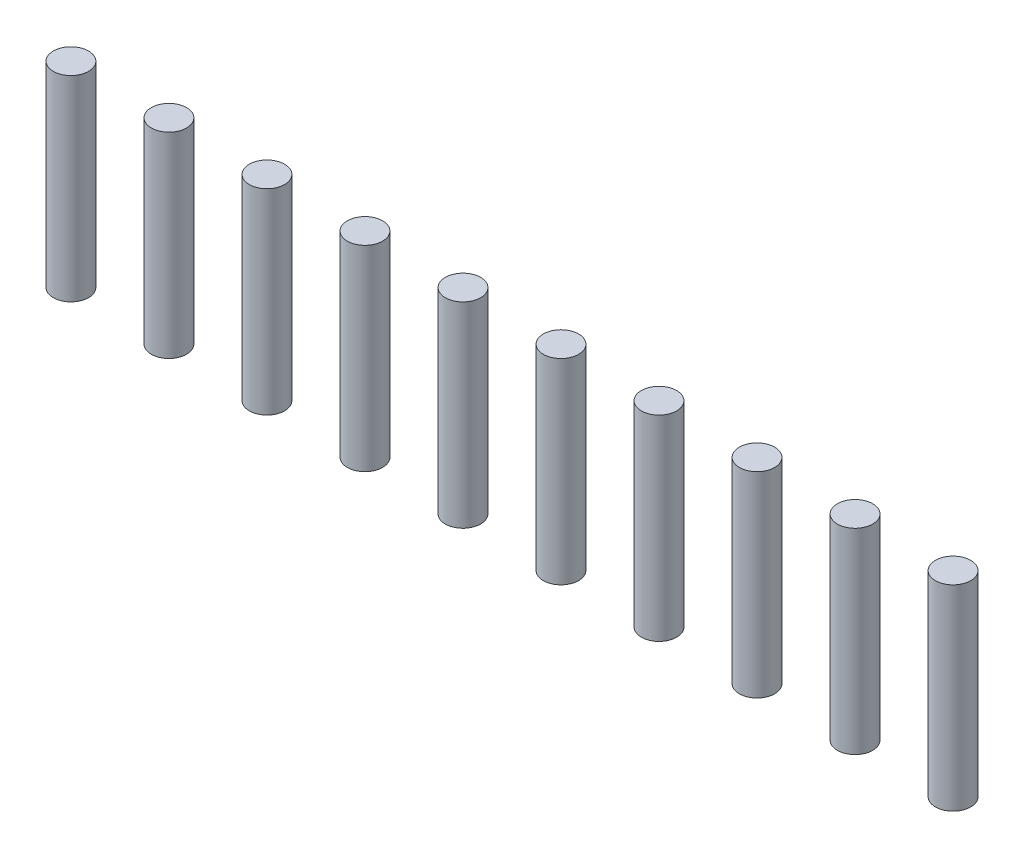
ISO-10303-21;
HEADER;
FILE_DESCRIPTION(('STEP AP214'),'2;1');
FILE_NAME('part.step','',(''),(''),'','','');
FILE_SCHEMA(('AUTOMOTIVE_DESIGN { 1 0 10303 214 1 1 1 1 }'));
ENDSEC;
DATA;
#1=APPLICATION_CONTEXT('core data for automotive mechanical design processes');
#2=APPLICATION_PROTOCOL_DEFINITION('international standard','automotive_design',2000,#1);
#3=PRODUCT_CONTEXT('',#1,'mechanical');
#4=PRODUCT('Part','Part','',(#3));
#5=PRODUCT_RELATED_PRODUCT_CATEGORY('part','',(#4));
#6=PRODUCT_DEFINITION_FORMATION('','',#4);
#7=PRODUCT_DEFINITION_CONTEXT('part definition',#1,'design');
#8=PRODUCT_DEFINITION('design','',#6,#7);
#9=PRODUCT_DEFINITION_SHAPE('','',#8);
#10=(LENGTH_UNIT() NAMED_UNIT(*) SI_UNIT(.MILLI.,.METRE.));
#11=(NAMED_UNIT(*) PLANE_ANGLE_UNIT() SI_UNIT($,.RADIAN.));
#12=(NAMED_UNIT(*) SI_UNIT($,.STERADIAN.) SOLID_ANGLE_UNIT());
#13=UNCERTAINTY_MEASURE_WITH_UNIT(LENGTH_MEASURE(1.E-05),#10,'distance_accuracy_value','');
#14=(GEOMETRIC_REPRESENTATION_CONTEXT(3) GLOBAL_UNCERTAINTY_ASSIGNED_CONTEXT((#13)) GLOBAL_UNIT_ASSIGNED_CONTEXT((#10,
#11,#12)) REPRESENTATION_CONTEXT('',''));
#15=CARTESIAN_POINT('',(0.,0.,0.));
#16=DIRECTION('',(0.,0.,1.));
#17=DIRECTION('',(1.,0.,0.));
#18=AXIS2_PLACEMENT_3D('',#15,#16,#17);
#19=CARTESIAN_POINT('',(90.,20.,0.));
#20=DIRECTION('',(0.,-1.,0.));
#21=DIRECTION('',(0.,0.,-1.));
#22=AXIS2_PLACEMENT_3D('',#19,#20,#21);
#23=CYLINDRICAL_SURFACE('',#22,1.79999999999999);
#24=CARTESIAN_POINT('',(90.,20.,0.));
#25=DIRECTION('',(0.,1.,0.));
#26=DIRECTION('',(0.,0.,1.));
#27=AXIS2_PLACEMENT_3D('',#24,#25,#26);
#28=CIRCLE('',#27,1.79999999999999);
#29=CARTESIAN_POINT('',(90.,20.,1.79999999999999));
#30=VERTEX_POINT('',#29);
#31=EDGE_CURVE('E11',#30,#30,#28,.T.);
#32=ORIENTED_EDGE('',*,*,#31,.F.);
#33=EDGE_LOOP('',(#32));
#34=FACE_BOUND('',#33,.T.);
#35=CARTESIAN_POINT('',(90.,0.,0.));
#36=DIRECTION('',(0.,1.,0.));
#37=DIRECTION('',(0.,0.,1.));
#38=AXIS2_PLACEMENT_3D('',#35,#36,#37);
#39=CIRCLE('',#38,1.79999999999999);
#40=CARTESIAN_POINT('',(90.,0.,1.79999999999999));
#41=VERTEX_POINT('',#40);
#42=EDGE_CURVE('E49',#41,#41,#39,.T.);
#43=ORIENTED_EDGE('',*,*,#42,.T.);
#44=EDGE_LOOP('',(#43));
#45=FACE_BOUND('',#44,.T.);
#46=ADVANCED_FACE('F46',(#34,#45),#23,.T.);
#47=CARTESIAN_POINT('',(90.,20.,0.));
#48=DIRECTION('',(0.,1.,0.));
#49=DIRECTION('',(0.,0.,1.));
#50=AXIS2_PLACEMENT_3D('',#47,#48,#49);
#51=PLANE('',#50);
#52=ORIENTED_EDGE('',*,*,#31,.T.);
#53=EDGE_LOOP('',(#52));
#54=FACE_BOUND('',#53,.T.);
#55=ADVANCED_FACE('F61',(#54),#51,.T.);
#56=CARTESIAN_POINT('',(90.,0.,0.));
#57=DIRECTION('',(0.,1.,0.));
#58=DIRECTION('',(0.,0.,1.));
#59=AXIS2_PLACEMENT_3D('',#56,#57,#58);
#60=PLANE('',#59);
#61=ORIENTED_EDGE('',*,*,#42,.F.);
#62=EDGE_LOOP('',(#61));
#63=FACE_BOUND('',#62,.T.);
#64=ADVANCED_FACE('F59',(#63),#60,.F.);
#65=CLOSED_SHELL('',(#46,#55,#64));
#66=MANIFOLD_SOLID_BREP('B2',#65);
#67=CARTESIAN_POINT('',(80.,20.,0.));
#68=DIRECTION('',(0.,-1.,0.));
#69=DIRECTION('',(0.,0.,-1.));
#70=AXIS2_PLACEMENT_3D('',#67,#68,#69);
#71=CYLINDRICAL_SURFACE('',#70,1.79999999999999);
#72=CARTESIAN_POINT('',(80.,20.,0.));
#73=DIRECTION('',(0.,1.,0.));
#74=DIRECTION('',(0.,0.,1.));
#75=AXIS2_PLACEMENT_3D('',#72,#73,#74);
#76=CIRCLE('',#75,1.79999999999999);
#77=CARTESIAN_POINT('',(80.,20.,1.79999999999999));
#78=VERTEX_POINT('',#77);
#79=EDGE_CURVE('E45',#78,#78,#76,.T.);
#80=ORIENTED_EDGE('',*,*,#79,.F.);
#81=EDGE_LOOP('',(#80));
#82=FACE_BOUND('',#81,.T.);
#83=CARTESIAN_POINT('',(80.,0.,0.));
#84=DIRECTION('',(0.,1.,0.));
#85=DIRECTION('',(0.,0.,1.));
#86=AXIS2_PLACEMENT_3D('',#83,#84,#85);
#87=CIRCLE('',#86,1.79999999999999);
#88=CARTESIAN_POINT('',(80.,0.,1.79999999999999));
#89=VERTEX_POINT('',#88);
#90=EDGE_CURVE('E98',#89,#89,#87,.T.);
#91=ORIENTED_EDGE('',*,*,#90,.T.);
#92=EDGE_LOOP('',(#91));
#93=FACE_BOUND('',#92,.T.);
#94=ADVANCED_FACE('F95',(#82,#93),#71,.T.);
#95=CARTESIAN_POINT('',(80.,20.,0.));
#96=DIRECTION('',(0.,1.,0.));
#97=DIRECTION('',(0.,0.,1.));
#98=AXIS2_PLACEMENT_3D('',#95,#96,#97);
#99=PLANE('',#98);
#100=ORIENTED_EDGE('',*,*,#79,.T.);
#101=EDGE_LOOP('',(#100));
#102=FACE_BOUND('',#101,.T.);
#103=ADVANCED_FACE('F110',(#102),#99,.T.);
#104=CARTESIAN_POINT('',(80.,0.,0.));
#105=DIRECTION('',(0.,1.,0.));
#106=DIRECTION('',(0.,0.,1.));
#107=AXIS2_PLACEMENT_3D('',#104,#105,#106);
#108=PLANE('',#107);
#109=ORIENTED_EDGE('',*,*,#90,.F.);
#110=EDGE_LOOP('',(#109));
#111=FACE_BOUND('',#110,.T.);
#112=ADVANCED_FACE('F108',(#111),#108,.F.);
#113=CLOSED_SHELL('',(#94,#103,#112));
#114=MANIFOLD_SOLID_BREP('B6',#113);
#115=CARTESIAN_POINT('',(70.,20.,0.));
#116=DIRECTION('',(0.,-1.,0.));
#117=DIRECTION('',(0.,0.,-1.));
#118=AXIS2_PLACEMENT_3D('',#115,#116,#117);
#119=CYLINDRICAL_SURFACE('',#118,1.79999999999999);
#120=CARTESIAN_POINT('',(70.,20.,0.));
#121=DIRECTION('',(0.,1.,0.));
#122=DIRECTION('',(0.,0.,1.));
#123=AXIS2_PLACEMENT_3D('',#120,#121,#122);
#124=CIRCLE('',#123,1.79999999999999);
#125=CARTESIAN_POINT('',(70.,20.,1.79999999999999));
#126=VERTEX_POINT('',#125);
#127=EDGE_CURVE('E94',#126,#126,#124,.T.);
#128=ORIENTED_EDGE('',*,*,#127,.F.);
#129=EDGE_LOOP('',(#128));
#130=FACE_BOUND('',#129,.T.);
#131=CARTESIAN_POINT('',(70.,0.,0.));
#132=DIRECTION('',(0.,1.,0.));
#133=DIRECTION('',(0.,0.,1.));
#134=AXIS2_PLACEMENT_3D('',#131,#132,#133);
#135=CIRCLE('',#134,1.79999999999999);
#136=CARTESIAN_POINT('',(70.,0.,1.79999999999999));
#137=VERTEX_POINT('',#136);
#138=EDGE_CURVE('E147',#137,#137,#135,.T.);
#139=ORIENTED_EDGE('',*,*,#138,.T.);
#140=EDGE_LOOP('',(#139));
#141=FACE_BOUND('',#140,.T.);
#142=ADVANCED_FACE('F144',(#130,#141),#119,.T.);
#143=CARTESIAN_POINT('',(70.,20.,0.));
#144=DIRECTION('',(0.,1.,0.));
#145=DIRECTION('',(0.,0.,1.));
#146=AXIS2_PLACEMENT_3D('',#143,#144,#145);
#147=PLANE('',#146);
#148=ORIENTED_EDGE('',*,*,#127,.T.);
#149=EDGE_LOOP('',(#148));
#150=FACE_BOUND('',#149,.T.);
#151=ADVANCED_FACE('F159',(#150),#147,.T.);
#152=CARTESIAN_POINT('',(70.,0.,0.));
#153=DIRECTION('',(0.,1.,0.));
#154=DIRECTION('',(0.,0.,1.));
#155=AXIS2_PLACEMENT_3D('',#152,#153,#154);
#156=PLANE('',#155);
#157=ORIENTED_EDGE('',*,*,#138,.F.);
#158=EDGE_LOOP('',(#157));
#159=FACE_BOUND('',#158,.T.);
#160=ADVANCED_FACE('F157',(#159),#156,.F.);
#161=CLOSED_SHELL('',(#142,#151,#160));
#162=MANIFOLD_SOLID_BREP('B40',#161);
#163=CARTESIAN_POINT('',(60.,20.,0.));
#164=DIRECTION('',(0.,-1.,0.));
#165=DIRECTION('',(0.,0.,-1.));
#166=AXIS2_PLACEMENT_3D('',#163,#164,#165);
#167=CYLINDRICAL_SURFACE('',#166,1.8);
#168=CARTESIAN_POINT('',(60.,20.,0.));
#169=DIRECTION('',(0.,1.,0.));
#170=DIRECTION('',(0.,0.,1.));
#171=AXIS2_PLACEMENT_3D('',#168,#169,#170);
#172=CIRCLE('',#171,1.8);
#173=CARTESIAN_POINT('',(60.,20.,1.8));
#174=VERTEX_POINT('',#173);
#175=EDGE_CURVE('E143',#174,#174,#172,.T.);
#176=ORIENTED_EDGE('',*,*,#175,.F.);
#177=EDGE_LOOP('',(#176));
#178=FACE_BOUND('',#177,.T.);
#179=CARTESIAN_POINT('',(60.,0.,0.));
#180=DIRECTION('',(0.,1.,0.));
#181=DIRECTION('',(0.,0.,1.));
#182=AXIS2_PLACEMENT_3D('',#179,#180,#181);
#183=CIRCLE('',#182,1.8);
#184=CARTESIAN_POINT('',(60.,0.,1.8));
#185=VERTEX_POINT('',#184);
#186=EDGE_CURVE('E196',#185,#185,#183,.T.);
#187=ORIENTED_EDGE('',*,*,#186,.T.);
#188=EDGE_LOOP('',(#187));
#189=FACE_BOUND('',#188,.T.);
#190=ADVANCED_FACE('F193',(#178,#189),#167,.T.);
#191=CARTESIAN_POINT('',(60.,20.,0.));
#192=DIRECTION('',(0.,1.,0.));
#193=DIRECTION('',(0.,0.,1.));
#194=AXIS2_PLACEMENT_3D('',#191,#192,#193);
#195=PLANE('',#194);
#196=ORIENTED_EDGE('',*,*,#175,.T.);
#197=EDGE_LOOP('',(#196));
#198=FACE_BOUND('',#197,.T.);
#199=ADVANCED_FACE('F208',(#198),#195,.T.);
#200=CARTESIAN_POINT('',(60.,0.,0.));
#201=DIRECTION('',(0.,1.,0.));
#202=DIRECTION('',(0.,0.,1.));
#203=AXIS2_PLACEMENT_3D('',#200,#201,#202);
#204=PLANE('',#203);
#205=ORIENTED_EDGE('',*,*,#186,.F.);
#206=EDGE_LOOP('',(#205));
#207=FACE_BOUND('',#206,.T.);
#208=ADVANCED_FACE('F206',(#207),#204,.F.);
#209=CLOSED_SHELL('',(#190,#199,#208));
#210=MANIFOLD_SOLID_BREP('B89',#209);
#211=CARTESIAN_POINT('',(50.,20.,0.));
#212=DIRECTION('',(0.,-1.,0.));
#213=DIRECTION('',(0.,0.,-1.));
#214=AXIS2_PLACEMENT_3D('',#211,#212,#213);
#215=CYLINDRICAL_SURFACE('',#214,1.8);
#216=CARTESIAN_POINT('',(50.,20.,0.));
#217=DIRECTION('',(0.,1.,0.));
#218=DIRECTION('',(0.,0.,1.));
#219=AXIS2_PLACEMENT_3D('',#216,#217,#218);
#220=CIRCLE('',#219,1.8);
#221=CARTESIAN_POINT('',(50.,20.,1.8));
#222=VERTEX_POINT('',#221);
#223=EDGE_CURVE('E192',#222,#222,#220,.T.);
#224=ORIENTED_EDGE('',*,*,#223,.F.);
#225=EDGE_LOOP('',(#224));
#226=FACE_BOUND('',#225,.T.);
#227=CARTESIAN_POINT('',(50.,0.,0.));
#228=DIRECTION('',(0.,1.,0.));
#229=DIRECTION('',(0.,0.,1.));
#230=AXIS2_PLACEMENT_3D('',#227,#228,#229);
#231=CIRCLE('',#230,1.8);
#232=CARTESIAN_POINT('',(50.,0.,1.8));
#233=VERTEX_POINT('',#232);
#234=EDGE_CURVE('E245',#233,#233,#231,.T.);
#235=ORIENTED_EDGE('',*,*,#234,.T.);
#236=EDGE_LOOP('',(#235));
#237=FACE_BOUND('',#236,.T.);
#238=ADVANCED_FACE('F242',(#226,#237),#215,.T.);
#239=CARTESIAN_POINT('',(50.,20.,0.));
#240=DIRECTION('',(0.,1.,0.));
#241=DIRECTION('',(0.,0.,1.));
#242=AXIS2_PLACEMENT_3D('',#239,#240,#241);
#243=PLANE('',#242);
#244=ORIENTED_EDGE('',*,*,#223,.T.);
#245=EDGE_LOOP('',(#244));
#246=FACE_BOUND('',#245,.T.);
#247=ADVANCED_FACE('F257',(#246),#243,.T.);
#248=CARTESIAN_POINT('',(50.,0.,0.));
#249=DIRECTION('',(0.,1.,0.));
#250=DIRECTION('',(0.,0.,1.));
#251=AXIS2_PLACEMENT_3D('',#248,#249,#250);
#252=PLANE('',#251);
#253=ORIENTED_EDGE('',*,*,#234,.F.);
#254=EDGE_LOOP('',(#253));
#255=FACE_BOUND('',#254,.T.);
#256=ADVANCED_FACE('F255',(#255),#252,.F.);
#257=CLOSED_SHELL('',(#238,#247,#256));
#258=MANIFOLD_SOLID_BREP('B138',#257);
#259=CARTESIAN_POINT('',(40.,20.,0.));
#260=DIRECTION('',(0.,-1.,0.));
#261=DIRECTION('',(0.,0.,-1.));
#262=AXIS2_PLACEMENT_3D('',#259,#260,#261);
#263=CYLINDRICAL_SURFACE('',#262,1.8);
#264=CARTESIAN_POINT('',(40.,20.,0.));
#265=DIRECTION('',(0.,1.,0.));
#266=DIRECTION('',(0.,0.,1.));
#267=AXIS2_PLACEMENT_3D('',#264,#265,#266);
#268=CIRCLE('',#267,1.8);
#269=CARTESIAN_POINT('',(40.,20.,1.8));
#270=VERTEX_POINT('',#269);
#271=EDGE_CURVE('E241',#270,#270,#268,.T.);
#272=ORIENTED_EDGE('',*,*,#271,.F.);
#273=EDGE_LOOP('',(#272));
#274=FACE_BOUND('',#273,.T.);
#275=CARTESIAN_POINT('',(40.,0.,0.));
#276=DIRECTION('',(0.,1.,0.));
#277=DIRECTION('',(0.,0.,1.));
#278=AXIS2_PLACEMENT_3D('',#275,#276,#277);
#279=CIRCLE('',#278,1.8);
#280=CARTESIAN_POINT('',(40.,0.,1.8));
#281=VERTEX_POINT('',#280);
#282=EDGE_CURVE('E294',#281,#281,#279,.T.);
#283=ORIENTED_EDGE('',*,*,#282,.T.);
#284=EDGE_LOOP('',(#283));
#285=FACE_BOUND('',#284,.T.);
#286=ADVANCED_FACE('F291',(#274,#285),#263,.T.);
#287=CARTESIAN_POINT('',(40.,20.,0.));
#288=DIRECTION('',(0.,1.,0.));
#289=DIRECTION('',(0.,0.,1.));
#290=AXIS2_PLACEMENT_3D('',#287,#288,#289);
#291=PLANE('',#290);
#292=ORIENTED_EDGE('',*,*,#271,.T.);
#293=EDGE_LOOP('',(#292));
#294=FACE_BOUND('',#293,.T.);
#295=ADVANCED_FACE('F306',(#294),#291,.T.);
#296=CARTESIAN_POINT('',(40.,0.,0.));
#297=DIRECTION('',(0.,1.,0.));
#298=DIRECTION('',(0.,0.,1.));
#299=AXIS2_PLACEMENT_3D('',#296,#297,#298);
#300=PLANE('',#299);
#301=ORIENTED_EDGE('',*,*,#282,.F.);
#302=EDGE_LOOP('',(#301));
#303=FACE_BOUND('',#302,.T.);
#304=ADVANCED_FACE('F304',(#303),#300,.F.);
#305=CLOSED_SHELL('',(#286,#295,#304));
#306=MANIFOLD_SOLID_BREP('B187',#305);
#307=CARTESIAN_POINT('',(30.,20.,0.));
#308=DIRECTION('',(0.,-1.,0.));
#309=DIRECTION('',(0.,0.,-1.));
#310=AXIS2_PLACEMENT_3D('',#307,#308,#309);
#311=CYLINDRICAL_SURFACE('',#310,1.8);
#312=CARTESIAN_POINT('',(30.,20.,0.));
#313=DIRECTION('',(0.,1.,0.));
#314=DIRECTION('',(0.,0.,1.));
#315=AXIS2_PLACEMENT_3D('',#312,#313,#314);
#316=CIRCLE('',#315,1.8);
#317=CARTESIAN_POINT('',(30.,20.,1.8));
#318=VERTEX_POINT('',#317);
#319=EDGE_CURVE('E290',#318,#318,#316,.T.);
#320=ORIENTED_EDGE('',*,*,#319,.F.);
#321=EDGE_LOOP('',(#320));
#322=FACE_BOUND('',#321,.T.);
#323=CARTESIAN_POINT('',(30.,0.,0.));
#324=DIRECTION('',(0.,1.,0.));
#325=DIRECTION('',(0.,0.,1.));
#326=AXIS2_PLACEMENT_3D('',#323,#324,#325);
#327=CIRCLE('',#326,1.8);
#328=CARTESIAN_POINT('',(30.,0.,1.8));
#329=VERTEX_POINT('',#328);
#330=EDGE_CURVE('E343',#329,#329,#327,.T.);
#331=ORIENTED_EDGE('',*,*,#330,.T.);
#332=EDGE_LOOP('',(#331));
#333=FACE_BOUND('',#332,.T.);
#334=ADVANCED_FACE('F340',(#322,#333),#311,.T.);
#335=CARTESIAN_POINT('',(30.,20.,0.));
#336=DIRECTION('',(0.,1.,0.));
#337=DIRECTION('',(0.,0.,1.));
#338=AXIS2_PLACEMENT_3D('',#335,#336,#337);
#339=PLANE('',#338);
#340=ORIENTED_EDGE('',*,*,#319,.T.);
#341=EDGE_LOOP('',(#340));
#342=FACE_BOUND('',#341,.T.);
#343=ADVANCED_FACE('F357',(#342),#339,.T.);
#344=CARTESIAN_POINT('',(30.,0.,0.));
#345=DIRECTION('',(0.,1.,0.));
#346=DIRECTION('',(0.,0.,1.));
#347=AXIS2_PLACEMENT_3D('',#344,#345,#346);
#348=PLANE('',#347);
#349=ORIENTED_EDGE('',*,*,#330,.F.);
#350=EDGE_LOOP('',(#349));
#351=FACE_BOUND('',#350,.T.);
#352=ADVANCED_FACE('F355',(#351),#348,.F.);
#353=CLOSED_SHELL('',(#334,#343,#352));
#354=MANIFOLD_SOLID_BREP('B236',#353);
#355=CARTESIAN_POINT('',(20.,20.,0.));
#356=DIRECTION('',(0.,-1.,0.));
#357=DIRECTION('',(0.,0.,-1.));
#358=AXIS2_PLACEMENT_3D('',#355,#356,#357);
#359=CYLINDRICAL_SURFACE('',#358,1.8);
#360=CARTESIAN_POINT('',(20.,20.,0.));
#361=DIRECTION('',(0.,1.,0.));
#362=DIRECTION('',(0.,0.,1.));
#363=AXIS2_PLACEMENT_3D('',#360,#361,#362);
#364=CIRCLE('',#363,1.8);
#365=CARTESIAN_POINT('',(20.,20.,1.8));
#366=VERTEX_POINT('',#365);
#367=EDGE_CURVE('E339',#366,#366,#364,.T.);
#368=ORIENTED_EDGE('',*,*,#367,.F.);
#369=EDGE_LOOP('',(#368));
#370=FACE_BOUND('',#369,.T.);
#371=CARTESIAN_POINT('',(20.,0.,0.));
#372=DIRECTION('',(0.,1.,0.));
#373=DIRECTION('',(0.,0.,1.));
#374=AXIS2_PLACEMENT_3D('',#371,#372,#373);
#375=CIRCLE('',#374,1.8);
#376=CARTESIAN_POINT('',(20.,0.,1.8));
#377=VERTEX_POINT('',#376);
#378=EDGE_CURVE('E394',#377,#377,#375,.T.);
#379=ORIENTED_EDGE('',*,*,#378,.T.);
#380=EDGE_LOOP('',(#379));
#381=FACE_BOUND('',#380,.T.);
#382=ADVANCED_FACE('F391',(#370,#381),#359,.T.);
#383=CARTESIAN_POINT('',(20.,20.,0.));
#384=DIRECTION('',(0.,1.,0.));
#385=DIRECTION('',(0.,0.,1.));
#386=AXIS2_PLACEMENT_3D('',#383,#384,#385);
#387=PLANE('',#386);
#388=ORIENTED_EDGE('',*,*,#367,.T.);
#389=EDGE_LOOP('',(#388));
#390=FACE_BOUND('',#389,.T.);
#391=ADVANCED_FACE('F406',(#390),#387,.T.);
#392=CARTESIAN_POINT('',(20.,0.,0.));
#393=DIRECTION('',(0.,1.,0.));
#394=DIRECTION('',(0.,0.,1.));
#395=AXIS2_PLACEMENT_3D('',#392,#393,#394);
#396=PLANE('',#395);
#397=ORIENTED_EDGE('',*,*,#378,.F.);
#398=EDGE_LOOP('',(#397));
#399=FACE_BOUND('',#398,.T.);
#400=ADVANCED_FACE('F404',(#399),#396,.F.);
#401=CLOSED_SHELL('',(#382,#391,#400));
#402=MANIFOLD_SOLID_BREP('B285',#401);
#403=CARTESIAN_POINT('',(10.,20.,0.));
#404=DIRECTION('',(0.,-1.,0.));
#405=DIRECTION('',(0.,0.,-1.));
#406=AXIS2_PLACEMENT_3D('',#403,#404,#405);
#407=CYLINDRICAL_SURFACE('',#406,1.8);
#408=CARTESIAN_POINT('',(10.,20.,0.));
#409=DIRECTION('',(0.,1.,0.));
#410=DIRECTION('',(0.,0.,1.));
#411=AXIS2_PLACEMENT_3D('',#408,#409,#410);
#412=CIRCLE('',#411,1.8);
#413=CARTESIAN_POINT('',(10.,20.,1.8));
#414=VERTEX_POINT('',#413);
#415=EDGE_CURVE('E390',#414,#414,#412,.T.);
#416=ORIENTED_EDGE('',*,*,#415,.F.);
#417=EDGE_LOOP('',(#416));
#418=FACE_BOUND('',#417,.T.);
#419=CARTESIAN_POINT('',(10.,0.,0.));
#420=DIRECTION('',(0.,1.,0.));
#421=DIRECTION('',(0.,0.,1.));
#422=AXIS2_PLACEMENT_3D('',#419,#420,#421);
#423=CIRCLE('',#422,1.8);
#424=CARTESIAN_POINT('',(10.,0.,1.8));
#425=VERTEX_POINT('',#424);
#426=EDGE_CURVE('E442',#425,#425,#423,.T.);
#427=ORIENTED_EDGE('',*,*,#426,.T.);
#428=EDGE_LOOP('',(#427));
#429=FACE_BOUND('',#428,.T.);
#430=ADVANCED_FACE('F439',(#418,#429),#407,.T.);
#431=CARTESIAN_POINT('',(10.,20.,0.));
#432=DIRECTION('',(0.,1.,0.));
#433=DIRECTION('',(0.,0.,1.));
#434=AXIS2_PLACEMENT_3D('',#431,#432,#433);
#435=PLANE('',#434);
#436=ORIENTED_EDGE('',*,*,#415,.T.);
#437=EDGE_LOOP('',(#436));
#438=FACE_BOUND('',#437,.T.);
#439=ADVANCED_FACE('F454',(#438),#435,.T.);
#440=CARTESIAN_POINT('',(10.,0.,0.));
#441=DIRECTION('',(0.,1.,0.));
#442=DIRECTION('',(0.,0.,1.));
#443=AXIS2_PLACEMENT_3D('',#440,#441,#442);
#444=PLANE('',#443);
#445=ORIENTED_EDGE('',*,*,#426,.F.);
#446=EDGE_LOOP('',(#445));
#447=FACE_BOUND('',#446,.T.);
#448=ADVANCED_FACE('F452',(#447),#444,.F.);
#449=CLOSED_SHELL('',(#430,#439,#448));
#450=MANIFOLD_SOLID_BREP('B334',#449);
#451=CARTESIAN_POINT('',(0.,20.,0.));
#452=DIRECTION('',(0.,-1.,0.));
#453=DIRECTION('',(0.,0.,-1.));
#454=AXIS2_PLACEMENT_3D('',#451,#452,#453);
#455=CYLINDRICAL_SURFACE('',#454,1.8);
#456=CARTESIAN_POINT('',(0.,20.,0.));
#457=DIRECTION('',(0.,1.,0.));
#458=DIRECTION('',(0.,0.,1.));
#459=AXIS2_PLACEMENT_3D('',#456,#457,#458);
#460=CIRCLE('',#459,1.8);
#461=CARTESIAN_POINT('',(0.,20.,1.8));
#462=VERTEX_POINT('',#461);
#463=EDGE_CURVE('E438',#462,#462,#460,.T.);
#464=ORIENTED_EDGE('',*,*,#463,.F.);
#465=EDGE_LOOP('',(#464));
#466=FACE_BOUND('',#465,.T.);
#467=CARTESIAN_POINT('',(0.,0.,0.));
#468=DIRECTION('',(0.,1.,0.));
#469=DIRECTION('',(0.,0.,1.));
#470=AXIS2_PLACEMENT_3D('',#467,#468,#469);
#471=CIRCLE('',#470,1.8);
#472=CARTESIAN_POINT('',(0.,0.,1.8));
#473=VERTEX_POINT('',#472);
#474=EDGE_CURVE('E483',#473,#473,#471,.T.);
#475=ORIENTED_EDGE('',*,*,#474,.T.);
#476=EDGE_LOOP('',(#475));
#477=FACE_BOUND('',#476,.T.);
#478=ADVANCED_FACE('F480',(#466,#477),#455,.T.);
#479=CARTESIAN_POINT('',(0.,20.,0.));
#480=DIRECTION('',(0.,1.,0.));
#481=DIRECTION('',(0.,0.,1.));
#482=AXIS2_PLACEMENT_3D('',#479,#480,#481);
#483=PLANE('',#482);
#484=ORIENTED_EDGE('',*,*,#463,.T.);
#485=EDGE_LOOP('',(#484));
#486=FACE_BOUND('',#485,.T.);
#487=ADVANCED_FACE('F495',(#486),#483,.T.);
#488=CARTESIAN_POINT('',(0.,0.,0.));
#489=DIRECTION('',(0.,1.,0.));
#490=DIRECTION('',(0.,0.,1.));
#491=AXIS2_PLACEMENT_3D('',#488,#489,#490);
#492=PLANE('',#491);
#493=ORIENTED_EDGE('',*,*,#474,.F.);
#494=EDGE_LOOP('',(#493));
#495=FACE_BOUND('',#494,.T.);
#496=ADVANCED_FACE('F493',(#495),#492,.F.);
#497=CLOSED_SHELL('',(#478,#487,#496));
#498=MANIFOLD_SOLID_BREP('B385',#497);
#499=ADVANCED_BREP_SHAPE_REPRESENTATION('',(#18,#66,#114,#162,#210,#258,#306,#354,#402,#450,
#498),#14);
#500=SHAPE_DEFINITION_REPRESENTATION(#9,#499);
ENDSEC;
END-ISO-10303-21;
